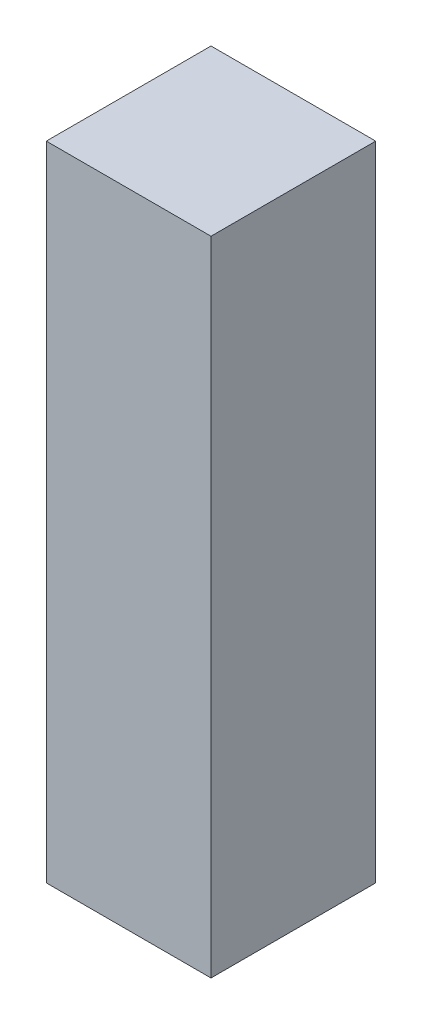
ISO-10303-21;
HEADER;
FILE_DESCRIPTION(('STEP AP214'),'2;1');
FILE_NAME('part.step','',(''),(''),'','','');
FILE_SCHEMA(('AUTOMOTIVE_DESIGN { 1 0 10303 214 1 1 1 1 }'));
ENDSEC;
DATA;
#1=APPLICATION_CONTEXT('core data for automotive mechanical design processes');
#2=APPLICATION_PROTOCOL_DEFINITION('international standard','automotive_design',2000,#1);
#3=PRODUCT_CONTEXT('',#1,'mechanical');
#4=PRODUCT('Part','Part','',(#3));
#5=PRODUCT_RELATED_PRODUCT_CATEGORY('part','',(#4));
#6=PRODUCT_DEFINITION_FORMATION('','',#4);
#7=PRODUCT_DEFINITION_CONTEXT('part definition',#1,'design');
#8=PRODUCT_DEFINITION('design','',#6,#7);
#9=PRODUCT_DEFINITION_SHAPE('','',#8);
#10=(LENGTH_UNIT() NAMED_UNIT(*) SI_UNIT(.MILLI.,.METRE.));
#11=(NAMED_UNIT(*) PLANE_ANGLE_UNIT() SI_UNIT($,.RADIAN.));
#12=(NAMED_UNIT(*) SI_UNIT($,.STERADIAN.) SOLID_ANGLE_UNIT());
#13=UNCERTAINTY_MEASURE_WITH_UNIT(LENGTH_MEASURE(1.E-05),#10,'distance_accuracy_value','');
#14=(GEOMETRIC_REPRESENTATION_CONTEXT(3) GLOBAL_UNCERTAINTY_ASSIGNED_CONTEXT((#13)) GLOBAL_UNIT_ASSIGNED_CONTEXT((#10,
#11,#12)) REPRESENTATION_CONTEXT('',''));
#15=CARTESIAN_POINT('',(0.,0.,0.));
#16=DIRECTION('',(0.,0.,1.));
#17=DIRECTION('',(1.,0.,0.));
#18=AXIS2_PLACEMENT_3D('',#15,#16,#17);
#19=CARTESIAN_POINT('',(-5.,39.,-5.));
#20=DIRECTION('',(1.,0.,0.));
#21=DIRECTION('',(0.,0.,-1.));
#22=AXIS2_PLACEMENT_3D('',#19,#20,#21);
#23=PLANE('',#22);
#24=DIRECTION('',(0.,0.,1.));
#25=VECTOR('',#24,1.);
#26=CARTESIAN_POINT('',(-5.,0.,-5.));
#27=LINE('',#26,#25);
#28=CARTESIAN_POINT('',(-5.,0.,-5.));
#29=VERTEX_POINT('',#28);
#30=CARTESIAN_POINT('',(-5.,0.,5.));
#31=VERTEX_POINT('',#30);
#32=EDGE_CURVE('E107',#29,#31,#27,.T.);
#33=ORIENTED_EDGE('',*,*,#32,.T.);
#34=DIRECTION('',(0.,-1.,0.));
#35=VECTOR('',#34,1.);
#36=CARTESIAN_POINT('',(-5.,39.,5.));
#37=LINE('',#36,#35);
#38=CARTESIAN_POINT('',(-5.,39.,5.));
#39=VERTEX_POINT('',#38);
#40=EDGE_CURVE('E11',#39,#31,#37,.T.);
#41=ORIENTED_EDGE('',*,*,#40,.F.);
#42=DIRECTION('',(0.,0.,1.));
#43=VECTOR('',#42,1.);
#44=CARTESIAN_POINT('',(-5.,39.,-5.));
#45=LINE('',#44,#43);
#46=CARTESIAN_POINT('',(-5.,39.,-5.));
#47=VERTEX_POINT('',#46);
#48=EDGE_CURVE('E92',#47,#39,#45,.T.);
#49=ORIENTED_EDGE('',*,*,#48,.F.);
#50=DIRECTION('',(0.,-1.,0.));
#51=VECTOR('',#50,1.);
#52=CARTESIAN_POINT('',(-5.,39.,-5.));
#53=LINE('',#52,#51);
#54=EDGE_CURVE('E105',#47,#29,#53,.T.);
#55=ORIENTED_EDGE('',*,*,#54,.T.);
#56=EDGE_LOOP('',(#33,#41,#49,#55));
#57=FACE_BOUND('',#56,.T.);
#58=ADVANCED_FACE('F43',(#57),#23,.F.);
#59=CARTESIAN_POINT('',(-5.,39.,5.));
#60=DIRECTION('',(0.,0.,-1.));
#61=DIRECTION('',(-1.,0.,0.));
#62=AXIS2_PLACEMENT_3D('',#59,#60,#61);
#63=PLANE('',#62);
#64=DIRECTION('',(1.,0.,0.));
#65=VECTOR('',#64,1.);
#66=CARTESIAN_POINT('',(-5.,0.,5.));
#67=LINE('',#66,#65);
#68=CARTESIAN_POINT('',(5.,0.,5.));
#69=VERTEX_POINT('',#68);
#70=EDGE_CURVE('E97',#31,#69,#67,.T.);
#71=ORIENTED_EDGE('',*,*,#70,.T.);
#72=DIRECTION('',(0.,-1.,0.));
#73=VECTOR('',#72,1.);
#74=CARTESIAN_POINT('',(5.,39.,5.));
#75=LINE('',#74,#73);
#76=CARTESIAN_POINT('',(5.,39.,5.));
#77=VERTEX_POINT('',#76);
#78=EDGE_CURVE('E51',#77,#69,#75,.T.);
#79=ORIENTED_EDGE('',*,*,#78,.F.);
#80=DIRECTION('',(1.,0.,0.));
#81=VECTOR('',#80,1.);
#82=CARTESIAN_POINT('',(-5.,39.,5.));
#83=LINE('',#82,#81);
#84=EDGE_CURVE('E87',#39,#77,#83,.T.);
#85=ORIENTED_EDGE('',*,*,#84,.F.);
#86=ORIENTED_EDGE('',*,*,#40,.T.);
#87=EDGE_LOOP('',(#71,#79,#85,#86));
#88=FACE_BOUND('',#87,.T.);
#89=ADVANCED_FACE('F100',(#88),#63,.F.);
#90=CARTESIAN_POINT('',(5.,39.,5.));
#91=DIRECTION('',(-1.,0.,0.));
#92=DIRECTION('',(0.,0.,1.));
#93=AXIS2_PLACEMENT_3D('',#90,#91,#92);
#94=PLANE('',#93);
#95=DIRECTION('',(0.,0.,-1.));
#96=VECTOR('',#95,1.);
#97=CARTESIAN_POINT('',(5.,0.,5.));
#98=LINE('',#97,#96);
#99=CARTESIAN_POINT('',(5.,0.,-5.));
#100=VERTEX_POINT('',#99);
#101=EDGE_CURVE('E78',#69,#100,#98,.T.);
#102=ORIENTED_EDGE('',*,*,#101,.T.);
#103=DIRECTION('',(0.,-1.,0.));
#104=VECTOR('',#103,1.);
#105=CARTESIAN_POINT('',(5.,39.,-5.));
#106=LINE('',#105,#104);
#107=CARTESIAN_POINT('',(5.,39.,-5.));
#108=VERTEX_POINT('',#107);
#109=EDGE_CURVE('E98',#108,#100,#106,.T.);
#110=ORIENTED_EDGE('',*,*,#109,.F.);
#111=DIRECTION('',(0.,0.,-1.));
#112=VECTOR('',#111,1.);
#113=CARTESIAN_POINT('',(5.,39.,5.));
#114=LINE('',#113,#112);
#115=EDGE_CURVE('E95',#77,#108,#114,.T.);
#116=ORIENTED_EDGE('',*,*,#115,.F.);
#117=ORIENTED_EDGE('',*,*,#78,.T.);
#118=EDGE_LOOP('',(#102,#110,#116,#117));
#119=FACE_BOUND('',#118,.T.);
#120=ADVANCED_FACE('F99',(#119),#94,.F.);
#121=CARTESIAN_POINT('',(5.,39.,-5.));
#122=DIRECTION('',(0.,0.,1.));
#123=DIRECTION('',(1.,0.,0.));
#124=AXIS2_PLACEMENT_3D('',#121,#122,#123);
#125=PLANE('',#124);
#126=DIRECTION('',(-1.,0.,0.));
#127=VECTOR('',#126,1.);
#128=CARTESIAN_POINT('',(5.,0.,-5.));
#129=LINE('',#128,#127);
#130=EDGE_CURVE('E85',#100,#29,#129,.T.);
#131=ORIENTED_EDGE('',*,*,#130,.T.);
#132=ORIENTED_EDGE('',*,*,#54,.F.);
#133=DIRECTION('',(-1.,0.,0.));
#134=VECTOR('',#133,1.);
#135=CARTESIAN_POINT('',(5.,39.,-5.));
#136=LINE('',#135,#134);
#137=EDGE_CURVE('E56',#108,#47,#136,.T.);
#138=ORIENTED_EDGE('',*,*,#137,.F.);
#139=ORIENTED_EDGE('',*,*,#109,.T.);
#140=EDGE_LOOP('',(#131,#132,#138,#139));
#141=FACE_BOUND('',#140,.T.);
#142=ADVANCED_FACE('F111',(#141),#125,.F.);
#143=CARTESIAN_POINT('',(0.,39.,0.));
#144=DIRECTION('',(0.,1.,0.));
#145=DIRECTION('',(0.,0.,1.));
#146=AXIS2_PLACEMENT_3D('',#143,#144,#145);
#147=PLANE('',#146);
#148=ORIENTED_EDGE('',*,*,#48,.T.);
#149=ORIENTED_EDGE('',*,*,#84,.T.);
#150=ORIENTED_EDGE('',*,*,#115,.T.);
#151=ORIENTED_EDGE('',*,*,#137,.T.);
#152=EDGE_LOOP('',(#148,#149,#150,#151));
#153=FACE_BOUND('',#152,.T.);
#154=ADVANCED_FACE('F89',(#153),#147,.T.);
#155=CARTESIAN_POINT('',(0.,0.,0.));
#156=DIRECTION('',(0.,1.,0.));
#157=DIRECTION('',(0.,0.,1.));
#158=AXIS2_PLACEMENT_3D('',#155,#156,#157);
#159=PLANE('',#158);
#160=ORIENTED_EDGE('',*,*,#32,.F.);
#161=ORIENTED_EDGE('',*,*,#130,.F.);
#162=ORIENTED_EDGE('',*,*,#101,.F.);
#163=ORIENTED_EDGE('',*,*,#70,.F.);
#164=EDGE_LOOP('',(#160,#161,#162,#163));
#165=FACE_BOUND('',#164,.T.);
#166=ADVANCED_FACE('F117',(#165),#159,.F.);
#167=CLOSED_SHELL('',(#58,#89,#120,#142,#154,#166));
#168=MANIFOLD_SOLID_BREP('B2',#167);
#169=ADVANCED_BREP_SHAPE_REPRESENTATION('',(#18,#168),#14);
#170=SHAPE_DEFINITION_REPRESENTATION(#9,#169);
ENDSEC;
END-ISO-10303-21;
